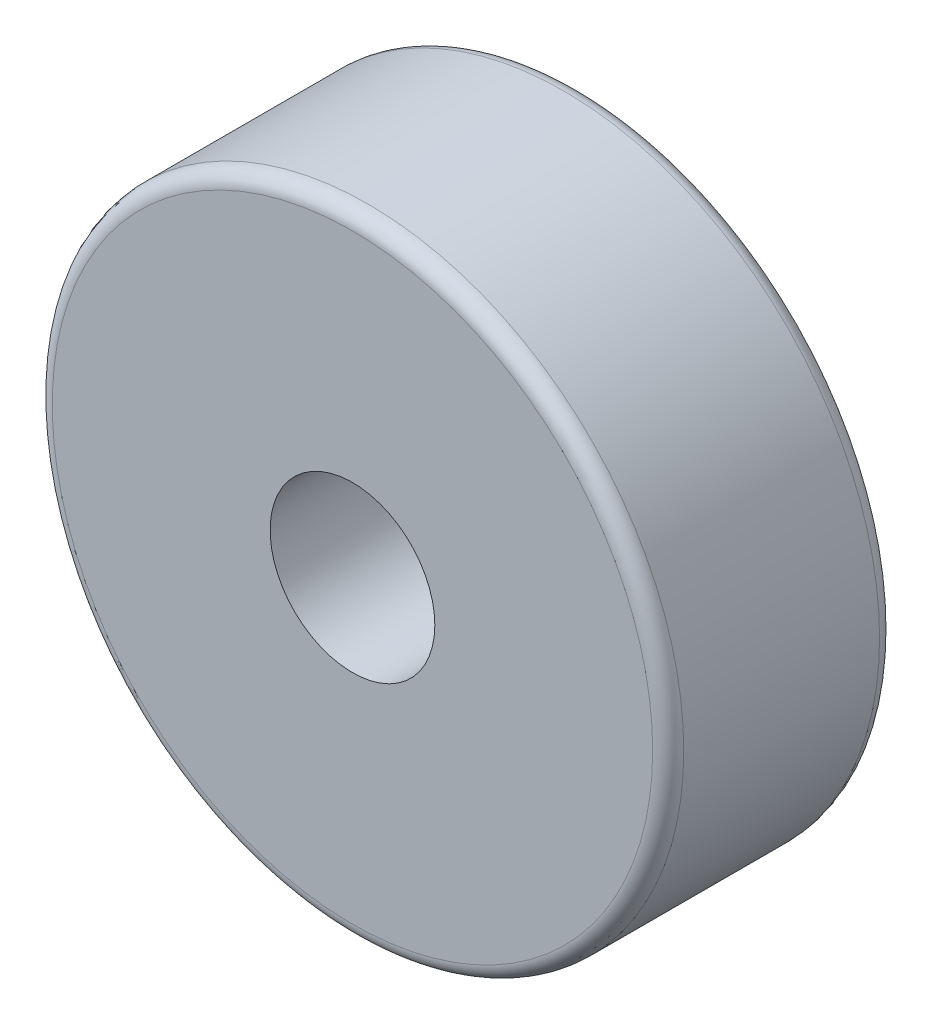
ISO-10303-21;
HEADER;
FILE_DESCRIPTION(('STEP AP214'),'2;1');
FILE_NAME('part.step','',(''),(''),'','','');
FILE_SCHEMA(('AUTOMOTIVE_DESIGN { 1 0 10303 214 1 1 1 1 }'));
ENDSEC;
DATA;
#1=APPLICATION_CONTEXT('core data for automotive mechanical design processes');
#2=APPLICATION_PROTOCOL_DEFINITION('international standard','automotive_design',2000,#1);
#3=PRODUCT_CONTEXT('',#1,'mechanical');
#4=PRODUCT('Part','Part','',(#3));
#5=PRODUCT_RELATED_PRODUCT_CATEGORY('part','',(#4));
#6=PRODUCT_DEFINITION_FORMATION('','',#4);
#7=PRODUCT_DEFINITION_CONTEXT('part definition',#1,'design');
#8=PRODUCT_DEFINITION('design','',#6,#7);
#9=PRODUCT_DEFINITION_SHAPE('','',#8);
#10=(LENGTH_UNIT() NAMED_UNIT(*) SI_UNIT(.MILLI.,.METRE.));
#11=(NAMED_UNIT(*) PLANE_ANGLE_UNIT() SI_UNIT($,.RADIAN.));
#12=(NAMED_UNIT(*) SI_UNIT($,.STERADIAN.) SOLID_ANGLE_UNIT());
#13=UNCERTAINTY_MEASURE_WITH_UNIT(LENGTH_MEASURE(1.E-05),#10,'distance_accuracy_value','');
#14=(GEOMETRIC_REPRESENTATION_CONTEXT(3) GLOBAL_UNCERTAINTY_ASSIGNED_CONTEXT((#13)) GLOBAL_UNIT_ASSIGNED_CONTEXT((#10,
#11,#12)) REPRESENTATION_CONTEXT('',''));
#15=CARTESIAN_POINT('',(0.,0.,0.));
#16=DIRECTION('',(0.,0.,1.));
#17=DIRECTION('',(1.,0.,0.));
#18=AXIS2_PLACEMENT_3D('',#15,#16,#17);
#19=CARTESIAN_POINT('',(0.,0.,73.));
#20=DIRECTION('',(0.,0.,1.));
#21=DIRECTION('',(1.,0.,0.));
#22=AXIS2_PLACEMENT_3D('',#19,#20,#21);
#23=PLANE('',#22);
#24=CARTESIAN_POINT('',(0.,0.,73.));
#25=DIRECTION('',(0.,0.,1.));
#26=DIRECTION('',(1.,0.,0.));
#27=AXIS2_PLACEMENT_3D('',#24,#25,#26);
#28=CIRCLE('',#27,96.6);
#29=CARTESIAN_POINT('',(96.6,0.,73.));
#30=VERTEX_POINT('',#29);
#31=EDGE_CURVE('E10',#30,#30,#28,.T.);
#32=ORIENTED_EDGE('',*,*,#31,.T.);
#33=EDGE_LOOP('',(#32));
#34=FACE_BOUND('',#33,.T.);
#35=CARTESIAN_POINT('',(0.,0.,73.));
#36=DIRECTION('',(0.,0.,1.));
#37=DIRECTION('',(1.,0.,0.));
#38=AXIS2_PLACEMENT_3D('',#35,#36,#37);
#39=CIRCLE('',#38,26.5);
#40=CARTESIAN_POINT('',(26.5,0.,73.));
#41=VERTEX_POINT('',#40);
#42=EDGE_CURVE('E51',#41,#41,#39,.T.);
#43=ORIENTED_EDGE('',*,*,#42,.F.);
#44=EDGE_LOOP('',(#43));
#45=FACE_BOUND('',#44,.T.);
#46=ADVANCED_FACE('F31',(#34,#45),#23,.T.);
#47=CARTESIAN_POINT('',(0.,0.,0.));
#48=DIRECTION('',(0.,0.,1.));
#49=DIRECTION('',(1.,0.,0.));
#50=AXIS2_PLACEMENT_3D('',#47,#48,#49);
#51=PLANE('',#50);
#52=CARTESIAN_POINT('',(0.,0.,0.));
#53=DIRECTION('',(0.,0.,1.));
#54=DIRECTION('',(1.,0.,0.));
#55=AXIS2_PLACEMENT_3D('',#52,#53,#54);
#56=CIRCLE('',#55,96.6);
#57=CARTESIAN_POINT('',(96.6,0.,0.));
#58=VERTEX_POINT('',#57);
#59=EDGE_CURVE('E38',#58,#58,#56,.F.);
#60=ORIENTED_EDGE('',*,*,#59,.T.);
#61=EDGE_LOOP('',(#60));
#62=FACE_BOUND('',#61,.T.);
#63=CARTESIAN_POINT('',(0.,0.,0.));
#64=DIRECTION('',(0.,0.,1.));
#65=DIRECTION('',(1.,0.,0.));
#66=AXIS2_PLACEMENT_3D('',#63,#64,#65);
#67=CIRCLE('',#66,26.5);
#68=CARTESIAN_POINT('',(26.5,0.,0.));
#69=VERTEX_POINT('',#68);
#70=EDGE_CURVE('E52',#69,#69,#67,.T.);
#71=ORIENTED_EDGE('',*,*,#70,.T.);
#72=EDGE_LOOP('',(#71));
#73=FACE_BOUND('',#72,.T.);
#74=ADVANCED_FACE('F62',(#62,#73),#51,.F.);
#75=CARTESIAN_POINT('',(0.,0.,73.));
#76=DIRECTION('',(0.,0.,-1.));
#77=DIRECTION('',(-1.,0.,0.));
#78=AXIS2_PLACEMENT_3D('',#75,#76,#77);
#79=CYLINDRICAL_SURFACE('',#78,101.6);
#80=CARTESIAN_POINT('',(0.,0.,5.));
#81=DIRECTION('',(0.,0.,1.));
#82=DIRECTION('',(1.,0.,0.));
#83=AXIS2_PLACEMENT_3D('',#80,#81,#82);
#84=CIRCLE('',#83,101.6);
#85=CARTESIAN_POINT('',(101.6,0.,5.));
#86=VERTEX_POINT('',#85);
#87=EDGE_CURVE('E42',#86,#86,#84,.T.);
#88=ORIENTED_EDGE('',*,*,#87,.T.);
#89=EDGE_LOOP('',(#88));
#90=FACE_BOUND('',#89,.T.);
#91=CARTESIAN_POINT('',(0.,0.,68.));
#92=DIRECTION('',(0.,0.,1.));
#93=DIRECTION('',(1.,0.,0.));
#94=AXIS2_PLACEMENT_3D('',#91,#92,#93);
#95=CIRCLE('',#94,101.6);
#96=CARTESIAN_POINT('',(101.6,0.,68.));
#97=VERTEX_POINT('',#96);
#98=EDGE_CURVE('E46',#97,#97,#95,.F.);
#99=ORIENTED_EDGE('',*,*,#98,.T.);
#100=EDGE_LOOP('',(#99));
#101=FACE_BOUND('',#100,.T.);
#102=ADVANCED_FACE('F67',(#90,#101),#79,.T.);
#103=CARTESIAN_POINT('',(0.,0.,73.));
#104=DIRECTION('',(0.,0.,-1.));
#105=DIRECTION('',(-1.,0.,0.));
#106=AXIS2_PLACEMENT_3D('',#103,#104,#105);
#107=CYLINDRICAL_SURFACE('',#106,26.5);
#108=ORIENTED_EDGE('',*,*,#42,.T.);
#109=EDGE_LOOP('',(#108));
#110=FACE_BOUND('',#109,.T.);
#111=ORIENTED_EDGE('',*,*,#70,.F.);
#112=EDGE_LOOP('',(#111));
#113=FACE_BOUND('',#112,.T.);
#114=ADVANCED_FACE('F58',(#110,#113),#107,.F.);
#115=CARTESIAN_POINT('',(0.,0.,5.));
#116=DIRECTION('',(0.,0.,1.));
#117=DIRECTION('',(1.,0.,0.));
#118=AXIS2_PLACEMENT_3D('',#115,#116,#117);
#119=TOROIDAL_SURFACE('',#118,96.6,5.);
#120=ORIENTED_EDGE('',*,*,#59,.F.);
#121=EDGE_LOOP('',(#120));
#122=FACE_BOUND('',#121,.T.);
#123=ORIENTED_EDGE('',*,*,#87,.F.);
#124=EDGE_LOOP('',(#123));
#125=FACE_BOUND('',#124,.T.);
#126=ADVANCED_FACE('F73',(#122,#125),#119,.T.);
#127=CARTESIAN_POINT('',(0.,0.,68.));
#128=DIRECTION('',(0.,0.,1.));
#129=DIRECTION('',(1.,0.,0.));
#130=AXIS2_PLACEMENT_3D('',#127,#128,#129);
#131=TOROIDAL_SURFACE('',#130,96.6,5.);
#132=ORIENTED_EDGE('',*,*,#98,.F.);
#133=EDGE_LOOP('',(#132));
#134=FACE_BOUND('',#133,.T.);
#135=ORIENTED_EDGE('',*,*,#31,.F.);
#136=EDGE_LOOP('',(#135));
#137=FACE_BOUND('',#136,.T.);
#138=ADVANCED_FACE('F33',(#134,#137),#131,.T.);
#139=CLOSED_SHELL('',(#46,#74,#102,#114,#126,#138));
#140=MANIFOLD_SOLID_BREP('B2',#139);
#141=ADVANCED_BREP_SHAPE_REPRESENTATION('',(#18,#140),#14);
#142=SHAPE_DEFINITION_REPRESENTATION(#9,#141);
ENDSEC;
END-ISO-10303-21;
